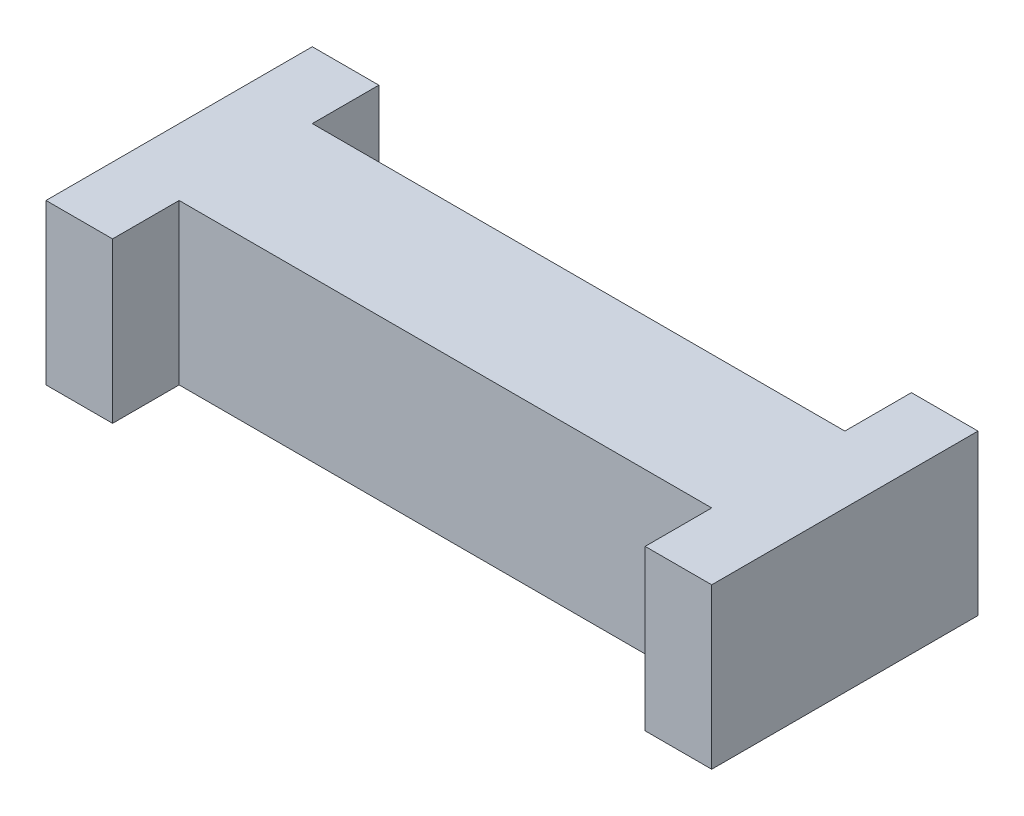
ISO-10303-21;
HEADER;
FILE_DESCRIPTION(('STEP AP214'),'2;1');
FILE_NAME('part.step','',(''),(''),'','','');
FILE_SCHEMA(('AUTOMOTIVE_DESIGN { 1 0 10303 214 1 1 1 1 }'));
ENDSEC;
DATA;
#1=APPLICATION_CONTEXT('core data for automotive mechanical design processes');
#2=APPLICATION_PROTOCOL_DEFINITION('international standard','automotive_design',2000,#1);
#3=PRODUCT_CONTEXT('',#1,'mechanical');
#4=PRODUCT('Part','Part','',(#3));
#5=PRODUCT_RELATED_PRODUCT_CATEGORY('part','',(#4));
#6=PRODUCT_DEFINITION_FORMATION('','',#4);
#7=PRODUCT_DEFINITION_CONTEXT('part definition',#1,'design');
#8=PRODUCT_DEFINITION('design','',#6,#7);
#9=PRODUCT_DEFINITION_SHAPE('','',#8);
#10=(LENGTH_UNIT() NAMED_UNIT(*) SI_UNIT(.MILLI.,.METRE.));
#11=(NAMED_UNIT(*) PLANE_ANGLE_UNIT() SI_UNIT($,.RADIAN.));
#12=(NAMED_UNIT(*) SI_UNIT($,.STERADIAN.) SOLID_ANGLE_UNIT());
#13=UNCERTAINTY_MEASURE_WITH_UNIT(LENGTH_MEASURE(1.E-05),#10,'distance_accuracy_value','');
#14=(GEOMETRIC_REPRESENTATION_CONTEXT(3) GLOBAL_UNCERTAINTY_ASSIGNED_CONTEXT((#13)) GLOBAL_UNIT_ASSIGNED_CONTEXT((#10,
#11,#12)) REPRESENTATION_CONTEXT('',''));
#15=CARTESIAN_POINT('',(0.,0.,0.));
#16=DIRECTION('',(0.,0.,1.));
#17=DIRECTION('',(1.,0.,0.));
#18=AXIS2_PLACEMENT_3D('',#15,#16,#17);
#19=CARTESIAN_POINT('',(-10.,6.,-7.5));
#20=DIRECTION('',(-1.,0.,0.));
#21=DIRECTION('',(0.,0.,1.));
#22=AXIS2_PLACEMENT_3D('',#19,#20,#21);
#23=PLANE('',#22);
#24=DIRECTION('',(0.,0.,-1.));
#25=VECTOR('',#24,1.);
#26=CARTESIAN_POINT('',(-10.,0.,-7.5));
#27=LINE('',#26,#25);
#28=CARTESIAN_POINT('',(-10.,0.,-5.));
#29=VERTEX_POINT('',#28);
#30=CARTESIAN_POINT('',(-10.,0.,-7.5));
#31=VERTEX_POINT('',#30);
#32=EDGE_CURVE('E159',#29,#31,#27,.T.);
#33=ORIENTED_EDGE('',*,*,#32,.T.);
#34=DIRECTION('',(0.,-1.,0.));
#35=VECTOR('',#34,1.);
#36=CARTESIAN_POINT('',(-10.,6.,-7.5));
#37=LINE('',#36,#35);
#38=CARTESIAN_POINT('',(-10.,6.,-7.5));
#39=VERTEX_POINT('',#38);
#40=EDGE_CURVE('E11',#39,#31,#37,.T.);
#41=ORIENTED_EDGE('',*,*,#40,.F.);
#42=DIRECTION('',(0.,0.,-1.));
#43=VECTOR('',#42,1.);
#44=CARTESIAN_POINT('',(-10.,6.,-7.5));
#45=LINE('',#44,#43);
#46=CARTESIAN_POINT('',(-10.,6.,-5.));
#47=VERTEX_POINT('',#46);
#48=EDGE_CURVE('E181',#47,#39,#45,.T.);
#49=ORIENTED_EDGE('',*,*,#48,.F.);
#50=DIRECTION('',(0.,-1.,0.));
#51=VECTOR('',#50,1.);
#52=CARTESIAN_POINT('',(-10.,6.,-5.));
#53=LINE('',#52,#51);
#54=EDGE_CURVE('E155',#47,#29,#53,.T.);
#55=ORIENTED_EDGE('',*,*,#54,.T.);
#56=EDGE_LOOP('',(#33,#41,#49,#55));
#57=FACE_BOUND('',#56,.T.);
#58=ADVANCED_FACE('F39',(#57),#23,.F.);
#59=CARTESIAN_POINT('',(-12.5,6.,-7.5));
#60=DIRECTION('',(0.,0.,1.));
#61=DIRECTION('',(1.,0.,0.));
#62=AXIS2_PLACEMENT_3D('',#59,#60,#61);
#63=PLANE('',#62);
#64=DIRECTION('',(-1.,0.,0.));
#65=VECTOR('',#64,1.);
#66=CARTESIAN_POINT('',(-12.5,0.,-7.5));
#67=LINE('',#66,#65);
#68=CARTESIAN_POINT('',(-12.5,0.,-7.5));
#69=VERTEX_POINT('',#68);
#70=EDGE_CURVE('E162',#31,#69,#67,.T.);
#71=ORIENTED_EDGE('',*,*,#70,.T.);
#72=DIRECTION('',(0.,-1.,0.));
#73=VECTOR('',#72,1.);
#74=CARTESIAN_POINT('',(-12.5,6.,-7.5));
#75=LINE('',#74,#73);
#76=CARTESIAN_POINT('',(-12.5,6.,-7.5));
#77=VERTEX_POINT('',#76);
#78=EDGE_CURVE('E47',#77,#69,#75,.T.);
#79=ORIENTED_EDGE('',*,*,#78,.F.);
#80=DIRECTION('',(-1.,0.,0.));
#81=VECTOR('',#80,1.);
#82=CARTESIAN_POINT('',(-12.5,6.,-7.5));
#83=LINE('',#82,#81);
#84=EDGE_CURVE('E110',#39,#77,#83,.T.);
#85=ORIENTED_EDGE('',*,*,#84,.F.);
#86=ORIENTED_EDGE('',*,*,#40,.T.);
#87=EDGE_LOOP('',(#71,#79,#85,#86));
#88=FACE_BOUND('',#87,.T.);
#89=ADVANCED_FACE('F259',(#88),#63,.F.);
#90=CARTESIAN_POINT('',(-12.5,6.,2.5));
#91=DIRECTION('',(1.,0.,0.));
#92=DIRECTION('',(0.,0.,-1.));
#93=AXIS2_PLACEMENT_3D('',#90,#91,#92);
#94=PLANE('',#93);
#95=DIRECTION('',(0.,0.,1.));
#96=VECTOR('',#95,1.);
#97=CARTESIAN_POINT('',(-12.5,0.,2.5));
#98=LINE('',#97,#96);
#99=CARTESIAN_POINT('',(-12.5,0.,2.5));
#100=VERTEX_POINT('',#99);
#101=EDGE_CURVE('E164',#69,#100,#98,.T.);
#102=ORIENTED_EDGE('',*,*,#101,.T.);
#103=DIRECTION('',(0.,-1.,0.));
#104=VECTOR('',#103,1.);
#105=CARTESIAN_POINT('',(-12.5,6.,2.5));
#106=LINE('',#105,#104);
#107=CARTESIAN_POINT('',(-12.5,6.,2.5));
#108=VERTEX_POINT('',#107);
#109=EDGE_CURVE('E200',#108,#100,#106,.T.);
#110=ORIENTED_EDGE('',*,*,#109,.F.);
#111=DIRECTION('',(0.,0.,1.));
#112=VECTOR('',#111,1.);
#113=CARTESIAN_POINT('',(-12.5,6.,2.5));
#114=LINE('',#113,#112);
#115=EDGE_CURVE('E208',#77,#108,#114,.T.);
#116=ORIENTED_EDGE('',*,*,#115,.F.);
#117=ORIENTED_EDGE('',*,*,#78,.T.);
#118=EDGE_LOOP('',(#102,#110,#116,#117));
#119=FACE_BOUND('',#118,.T.);
#120=ADVANCED_FACE('F206',(#119),#94,.F.);
#121=CARTESIAN_POINT('',(-10.,6.,2.5));
#122=DIRECTION('',(0.,0.,-1.));
#123=DIRECTION('',(-1.,0.,0.));
#124=AXIS2_PLACEMENT_3D('',#121,#122,#123);
#125=PLANE('',#124);
#126=DIRECTION('',(1.,0.,0.));
#127=VECTOR('',#126,1.);
#128=CARTESIAN_POINT('',(-10.,0.,2.5));
#129=LINE('',#128,#127);
#130=CARTESIAN_POINT('',(-10.,0.,2.5));
#131=VERTEX_POINT('',#130);
#132=EDGE_CURVE('E166',#100,#131,#129,.T.);
#133=ORIENTED_EDGE('',*,*,#132,.T.);
#134=DIRECTION('',(0.,-1.,0.));
#135=VECTOR('',#134,1.);
#136=CARTESIAN_POINT('',(-10.,6.,2.5));
#137=LINE('',#136,#135);
#138=CARTESIAN_POINT('',(-10.,6.,2.5));
#139=VERTEX_POINT('',#138);
#140=EDGE_CURVE('E197',#139,#131,#137,.T.);
#141=ORIENTED_EDGE('',*,*,#140,.F.);
#142=DIRECTION('',(1.,0.,0.));
#143=VECTOR('',#142,1.);
#144=CARTESIAN_POINT('',(-10.,6.,2.5));
#145=LINE('',#144,#143);
#146=EDGE_CURVE('E226',#108,#139,#145,.T.);
#147=ORIENTED_EDGE('',*,*,#146,.F.);
#148=ORIENTED_EDGE('',*,*,#109,.T.);
#149=EDGE_LOOP('',(#133,#141,#147,#148));
#150=FACE_BOUND('',#149,.T.);
#151=ADVANCED_FACE('F217',(#150),#125,.F.);
#152=CARTESIAN_POINT('',(-10.,6.,0.));
#153=DIRECTION('',(-1.,0.,0.));
#154=DIRECTION('',(0.,0.,1.));
#155=AXIS2_PLACEMENT_3D('',#152,#153,#154);
#156=PLANE('',#155);
#157=DIRECTION('',(0.,0.,-1.));
#158=VECTOR('',#157,1.);
#159=CARTESIAN_POINT('',(-10.,0.,0.));
#160=LINE('',#159,#158);
#161=CARTESIAN_POINT('',(-10.,0.,0.));
#162=VERTEX_POINT('',#161);
#163=EDGE_CURVE('E168',#131,#162,#160,.T.);
#164=ORIENTED_EDGE('',*,*,#163,.T.);
#165=DIRECTION('',(0.,-1.,0.));
#166=VECTOR('',#165,1.);
#167=CARTESIAN_POINT('',(-10.,6.,0.));
#168=LINE('',#167,#166);
#169=CARTESIAN_POINT('',(-10.,6.,0.));
#170=VERTEX_POINT('',#169);
#171=EDGE_CURVE('E194',#170,#162,#168,.T.);
#172=ORIENTED_EDGE('',*,*,#171,.F.);
#173=DIRECTION('',(0.,0.,-1.));
#174=VECTOR('',#173,1.);
#175=CARTESIAN_POINT('',(-10.,6.,0.));
#176=LINE('',#175,#174);
#177=EDGE_CURVE('E223',#139,#170,#176,.T.);
#178=ORIENTED_EDGE('',*,*,#177,.F.);
#179=ORIENTED_EDGE('',*,*,#140,.T.);
#180=EDGE_LOOP('',(#164,#172,#178,#179));
#181=FACE_BOUND('',#180,.T.);
#182=ADVANCED_FACE('F221',(#181),#156,.F.);
#183=CARTESIAN_POINT('',(10.,6.,0.));
#184=DIRECTION('',(0.,0.,-1.));
#185=DIRECTION('',(-1.,0.,0.));
#186=AXIS2_PLACEMENT_3D('',#183,#184,#185);
#187=PLANE('',#186);
#188=DIRECTION('',(1.,0.,0.));
#189=VECTOR('',#188,1.);
#190=CARTESIAN_POINT('',(10.,0.,0.));
#191=LINE('',#190,#189);
#192=CARTESIAN_POINT('',(10.,0.,0.));
#193=VERTEX_POINT('',#192);
#194=EDGE_CURVE('E170',#162,#193,#191,.T.);
#195=ORIENTED_EDGE('',*,*,#194,.T.);
#196=DIRECTION('',(0.,-1.,0.));
#197=VECTOR('',#196,1.);
#198=CARTESIAN_POINT('',(10.,6.,0.));
#199=LINE('',#198,#197);
#200=CARTESIAN_POINT('',(10.,6.,0.));
#201=VERTEX_POINT('',#200);
#202=EDGE_CURVE('E191',#201,#193,#199,.T.);
#203=ORIENTED_EDGE('',*,*,#202,.F.);
#204=DIRECTION('',(1.,0.,0.));
#205=VECTOR('',#204,1.);
#206=CARTESIAN_POINT('',(10.,6.,0.));
#207=LINE('',#206,#205);
#208=EDGE_CURVE('E225',#170,#201,#207,.T.);
#209=ORIENTED_EDGE('',*,*,#208,.F.);
#210=ORIENTED_EDGE('',*,*,#171,.T.);
#211=EDGE_LOOP('',(#195,#203,#209,#210));
#212=FACE_BOUND('',#211,.T.);
#213=ADVANCED_FACE('F272',(#212),#187,.F.);
#214=CARTESIAN_POINT('',(10.,6.,2.5));
#215=DIRECTION('',(1.,0.,0.));
#216=DIRECTION('',(0.,0.,-1.));
#217=AXIS2_PLACEMENT_3D('',#214,#215,#216);
#218=PLANE('',#217);
#219=DIRECTION('',(0.,0.,1.));
#220=VECTOR('',#219,1.);
#221=CARTESIAN_POINT('',(10.,0.,2.5));
#222=LINE('',#221,#220);
#223=CARTESIAN_POINT('',(10.,0.,2.5));
#224=VERTEX_POINT('',#223);
#225=EDGE_CURVE('E172',#193,#224,#222,.T.);
#226=ORIENTED_EDGE('',*,*,#225,.T.);
#227=DIRECTION('',(0.,-1.,0.));
#228=VECTOR('',#227,1.);
#229=CARTESIAN_POINT('',(10.,6.,2.5));
#230=LINE('',#229,#228);
#231=CARTESIAN_POINT('',(10.,6.,2.5));
#232=VERTEX_POINT('',#231);
#233=EDGE_CURVE('E188',#232,#224,#230,.T.);
#234=ORIENTED_EDGE('',*,*,#233,.F.);
#235=DIRECTION('',(0.,0.,1.));
#236=VECTOR('',#235,1.);
#237=CARTESIAN_POINT('',(10.,6.,2.5));
#238=LINE('',#237,#236);
#239=EDGE_CURVE('E228',#201,#232,#238,.T.);
#240=ORIENTED_EDGE('',*,*,#239,.F.);
#241=ORIENTED_EDGE('',*,*,#202,.T.);
#242=EDGE_LOOP('',(#226,#234,#240,#241));
#243=FACE_BOUND('',#242,.T.);
#244=ADVANCED_FACE('F275',(#243),#218,.F.);
#245=CARTESIAN_POINT('',(12.5,6.,2.5));
#246=DIRECTION('',(0.,0.,-1.));
#247=DIRECTION('',(-1.,0.,0.));
#248=AXIS2_PLACEMENT_3D('',#245,#246,#247);
#249=PLANE('',#248);
#250=DIRECTION('',(1.,0.,0.));
#251=VECTOR('',#250,1.);
#252=CARTESIAN_POINT('',(12.5,0.,2.5));
#253=LINE('',#252,#251);
#254=CARTESIAN_POINT('',(12.5,0.,2.5));
#255=VERTEX_POINT('',#254);
#256=EDGE_CURVE('E174',#224,#255,#253,.T.);
#257=ORIENTED_EDGE('',*,*,#256,.T.);
#258=DIRECTION('',(0.,-1.,0.));
#259=VECTOR('',#258,1.);
#260=CARTESIAN_POINT('',(12.5,6.,2.5));
#261=LINE('',#260,#259);
#262=CARTESIAN_POINT('',(12.5,6.,2.5));
#263=VERTEX_POINT('',#262);
#264=EDGE_CURVE('E185',#263,#255,#261,.T.);
#265=ORIENTED_EDGE('',*,*,#264,.F.);
#266=DIRECTION('',(1.,0.,0.));
#267=VECTOR('',#266,1.);
#268=CARTESIAN_POINT('',(12.5,6.,2.5));
#269=LINE('',#268,#267);
#270=EDGE_CURVE('E234',#232,#263,#269,.T.);
#271=ORIENTED_EDGE('',*,*,#270,.F.);
#272=ORIENTED_EDGE('',*,*,#233,.T.);
#273=EDGE_LOOP('',(#257,#265,#271,#272));
#274=FACE_BOUND('',#273,.T.);
#275=ADVANCED_FACE('F240',(#274),#249,.F.);
#276=CARTESIAN_POINT('',(12.5,6.,-7.5));
#277=DIRECTION('',(-1.,0.,0.));
#278=DIRECTION('',(0.,0.,1.));
#279=AXIS2_PLACEMENT_3D('',#276,#277,#278);
#280=PLANE('',#279);
#281=DIRECTION('',(0.,0.,-1.));
#282=VECTOR('',#281,1.);
#283=CARTESIAN_POINT('',(12.5,0.,-7.5));
#284=LINE('',#283,#282);
#285=CARTESIAN_POINT('',(12.5,0.,-7.5));
#286=VERTEX_POINT('',#285);
#287=EDGE_CURVE('E176',#255,#286,#284,.T.);
#288=ORIENTED_EDGE('',*,*,#287,.T.);
#289=DIRECTION('',(0.,-1.,0.));
#290=VECTOR('',#289,1.);
#291=CARTESIAN_POINT('',(12.5,6.,-7.5));
#292=LINE('',#291,#290);
#293=CARTESIAN_POINT('',(12.5,6.,-7.5));
#294=VERTEX_POINT('',#293);
#295=EDGE_CURVE('E150',#294,#286,#292,.T.);
#296=ORIENTED_EDGE('',*,*,#295,.F.);
#297=DIRECTION('',(0.,0.,-1.));
#298=VECTOR('',#297,1.);
#299=CARTESIAN_POINT('',(12.5,6.,-7.5));
#300=LINE('',#299,#298);
#301=EDGE_CURVE('E141',#263,#294,#300,.T.);
#302=ORIENTED_EDGE('',*,*,#301,.F.);
#303=ORIENTED_EDGE('',*,*,#264,.T.);
#304=EDGE_LOOP('',(#288,#296,#302,#303));
#305=FACE_BOUND('',#304,.T.);
#306=ADVANCED_FACE('F244',(#305),#280,.F.);
#307=CARTESIAN_POINT('',(9.99999999999999,6.,-7.5));
#308=DIRECTION('',(0.,0.,1.));
#309=DIRECTION('',(1.,0.,0.));
#310=AXIS2_PLACEMENT_3D('',#307,#308,#309);
#311=PLANE('',#310);
#312=DIRECTION('',(-1.,0.,0.));
#313=VECTOR('',#312,1.);
#314=CARTESIAN_POINT('',(9.99999999999999,0.,-7.5));
#315=LINE('',#314,#313);
#316=CARTESIAN_POINT('',(9.99999999999999,0.,-7.5));
#317=VERTEX_POINT('',#316);
#318=EDGE_CURVE('E149',#286,#317,#315,.T.);
#319=ORIENTED_EDGE('',*,*,#318,.T.);
#320=DIRECTION('',(0.,-1.,0.));
#321=VECTOR('',#320,1.);
#322=CARTESIAN_POINT('',(9.99999999999999,6.,-7.5));
#323=LINE('',#322,#321);
#324=CARTESIAN_POINT('',(9.99999999999999,6.,-7.5));
#325=VERTEX_POINT('',#324);
#326=EDGE_CURVE('E146',#325,#317,#323,.T.);
#327=ORIENTED_EDGE('',*,*,#326,.F.);
#328=DIRECTION('',(-1.,0.,0.));
#329=VECTOR('',#328,1.);
#330=CARTESIAN_POINT('',(9.99999999999999,6.,-7.5));
#331=LINE('',#330,#329);
#332=EDGE_CURVE('E135',#294,#325,#331,.T.);
#333=ORIENTED_EDGE('',*,*,#332,.F.);
#334=ORIENTED_EDGE('',*,*,#295,.T.);
#335=EDGE_LOOP('',(#319,#327,#333,#334));
#336=FACE_BOUND('',#335,.T.);
#337=ADVANCED_FACE('F147',(#336),#311,.F.);
#338=CARTESIAN_POINT('',(10.,6.,-5.));
#339=DIRECTION('',(1.,0.,0.));
#340=DIRECTION('',(0.,0.,-1.));
#341=AXIS2_PLACEMENT_3D('',#338,#339,#340);
#342=PLANE('',#341);
#343=DIRECTION('',(0.,0.,1.));
#344=VECTOR('',#343,1.);
#345=CARTESIAN_POINT('',(10.,0.,-5.));
#346=LINE('',#345,#344);
#347=CARTESIAN_POINT('',(10.,0.,-5.));
#348=VERTEX_POINT('',#347);
#349=EDGE_CURVE('E96',#317,#348,#346,.T.);
#350=ORIENTED_EDGE('',*,*,#349,.T.);
#351=DIRECTION('',(0.,-1.,0.));
#352=VECTOR('',#351,1.);
#353=CARTESIAN_POINT('',(10.,6.,-5.));
#354=LINE('',#353,#352);
#355=CARTESIAN_POINT('',(10.,6.,-5.));
#356=VERTEX_POINT('',#355);
#357=EDGE_CURVE('E151',#356,#348,#354,.T.);
#358=ORIENTED_EDGE('',*,*,#357,.F.);
#359=DIRECTION('',(0.,0.,1.));
#360=VECTOR('',#359,1.);
#361=CARTESIAN_POINT('',(10.,6.,-5.));
#362=LINE('',#361,#360);
#363=EDGE_CURVE('E139',#325,#356,#362,.T.);
#364=ORIENTED_EDGE('',*,*,#363,.F.);
#365=ORIENTED_EDGE('',*,*,#326,.T.);
#366=EDGE_LOOP('',(#350,#358,#364,#365));
#367=FACE_BOUND('',#366,.T.);
#368=ADVANCED_FACE('F153',(#367),#342,.F.);
#369=CARTESIAN_POINT('',(-10.,6.,-5.));
#370=DIRECTION('',(0.,0.,1.));
#371=DIRECTION('',(1.,0.,0.));
#372=AXIS2_PLACEMENT_3D('',#369,#370,#371);
#373=PLANE('',#372);
#374=DIRECTION('',(-1.,0.,0.));
#375=VECTOR('',#374,1.);
#376=CARTESIAN_POINT('',(-10.,0.,-5.));
#377=LINE('',#376,#375);
#378=EDGE_CURVE('E102',#348,#29,#377,.T.);
#379=ORIENTED_EDGE('',*,*,#378,.T.);
#380=ORIENTED_EDGE('',*,*,#54,.F.);
#381=DIRECTION('',(-1.,0.,0.));
#382=VECTOR('',#381,1.);
#383=CARTESIAN_POINT('',(-10.,6.,-5.));
#384=LINE('',#383,#382);
#385=EDGE_CURVE('E55',#356,#47,#384,.T.);
#386=ORIENTED_EDGE('',*,*,#385,.F.);
#387=ORIENTED_EDGE('',*,*,#357,.T.);
#388=EDGE_LOOP('',(#379,#380,#386,#387));
#389=FACE_BOUND('',#388,.T.);
#390=ADVANCED_FACE('F248',(#389),#373,.F.);
#391=CARTESIAN_POINT('',(0.,6.,0.));
#392=DIRECTION('',(0.,1.,0.));
#393=DIRECTION('',(0.,0.,1.));
#394=AXIS2_PLACEMENT_3D('',#391,#392,#393);
#395=PLANE('',#394);
#396=ORIENTED_EDGE('',*,*,#48,.T.);
#397=ORIENTED_EDGE('',*,*,#84,.T.);
#398=ORIENTED_EDGE('',*,*,#115,.T.);
#399=ORIENTED_EDGE('',*,*,#146,.T.);
#400=ORIENTED_EDGE('',*,*,#177,.T.);
#401=ORIENTED_EDGE('',*,*,#208,.T.);
#402=ORIENTED_EDGE('',*,*,#239,.T.);
#403=ORIENTED_EDGE('',*,*,#270,.T.);
#404=ORIENTED_EDGE('',*,*,#301,.T.);
#405=ORIENTED_EDGE('',*,*,#332,.T.);
#406=ORIENTED_EDGE('',*,*,#363,.T.);
#407=ORIENTED_EDGE('',*,*,#385,.T.);
#408=EDGE_LOOP('',(#396,#397,#398,#399,#400,#401,#402,#403,#404,#405,#406,#407));
#409=FACE_BOUND('',#408,.T.);
#410=ADVANCED_FACE('F137',(#409),#395,.T.);
#411=CARTESIAN_POINT('',(0.,0.,0.));
#412=DIRECTION('',(0.,1.,0.));
#413=DIRECTION('',(0.,0.,1.));
#414=AXIS2_PLACEMENT_3D('',#411,#412,#413);
#415=PLANE('',#414);
#416=ORIENTED_EDGE('',*,*,#32,.F.);
#417=ORIENTED_EDGE('',*,*,#378,.F.);
#418=ORIENTED_EDGE('',*,*,#349,.F.);
#419=ORIENTED_EDGE('',*,*,#318,.F.);
#420=ORIENTED_EDGE('',*,*,#287,.F.);
#421=ORIENTED_EDGE('',*,*,#256,.F.);
#422=ORIENTED_EDGE('',*,*,#225,.F.);
#423=ORIENTED_EDGE('',*,*,#194,.F.);
#424=ORIENTED_EDGE('',*,*,#163,.F.);
#425=ORIENTED_EDGE('',*,*,#132,.F.);
#426=ORIENTED_EDGE('',*,*,#101,.F.);
#427=ORIENTED_EDGE('',*,*,#70,.F.);
#428=EDGE_LOOP('',(#416,#417,#418,#419,#420,#421,#422,#423,#424,#425,#426,#427));
#429=FACE_BOUND('',#428,.T.);
#430=ADVANCED_FACE('F212',(#429),#415,.F.);
#431=CLOSED_SHELL('',(#58,#89,#120,#151,#182,#213,#244,#275,#306,#337,#368,#390,#410,#430));
#432=MANIFOLD_SOLID_BREP('B2',#431);
#433=ADVANCED_BREP_SHAPE_REPRESENTATION('',(#18,#432),#14);
#434=SHAPE_DEFINITION_REPRESENTATION(#9,#433);
ENDSEC;
END-ISO-10303-21;
